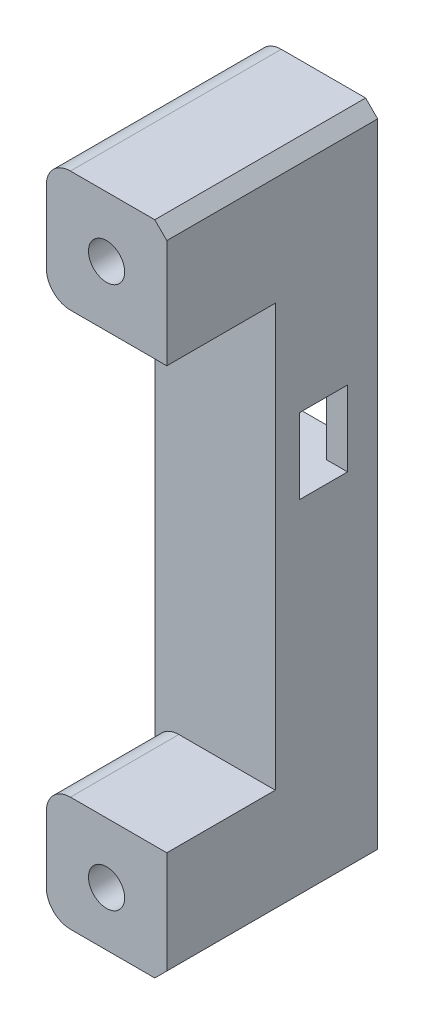
ISO-10303-21;
HEADER;
FILE_DESCRIPTION(('STEP AP214'),'2;1');
FILE_NAME('part.step','',(''),(''),'','','');
FILE_SCHEMA(('AUTOMOTIVE_DESIGN { 1 0 10303 214 1 1 1 1 }'));
ENDSEC;
DATA;
#1=APPLICATION_CONTEXT('core data for automotive mechanical design processes');
#2=APPLICATION_PROTOCOL_DEFINITION('international standard','automotive_design',2000,#1);
#3=PRODUCT_CONTEXT('',#1,'mechanical');
#4=PRODUCT('Part','Part','',(#3));
#5=PRODUCT_RELATED_PRODUCT_CATEGORY('part','',(#4));
#6=PRODUCT_DEFINITION_FORMATION('','',#4);
#7=PRODUCT_DEFINITION_CONTEXT('part definition',#1,'design');
#8=PRODUCT_DEFINITION('design','',#6,#7);
#9=PRODUCT_DEFINITION_SHAPE('','',#8);
#10=(LENGTH_UNIT() NAMED_UNIT(*) SI_UNIT(.MILLI.,.METRE.));
#11=(NAMED_UNIT(*) PLANE_ANGLE_UNIT() SI_UNIT($,.RADIAN.));
#12=(NAMED_UNIT(*) SI_UNIT($,.STERADIAN.) SOLID_ANGLE_UNIT());
#13=UNCERTAINTY_MEASURE_WITH_UNIT(LENGTH_MEASURE(1.E-05),#10,'distance_accuracy_value','');
#14=(GEOMETRIC_REPRESENTATION_CONTEXT(3) GLOBAL_UNCERTAINTY_ASSIGNED_CONTEXT((#13)) GLOBAL_UNIT_ASSIGNED_CONTEXT((#10,
#11,#12)) REPRESENTATION_CONTEXT('',''));
#15=CARTESIAN_POINT('',(0.,0.,0.));
#16=DIRECTION('',(0.,0.,1.));
#17=DIRECTION('',(1.,0.,0.));
#18=AXIS2_PLACEMENT_3D('',#15,#16,#17);
#19=CARTESIAN_POINT('',(0.,-5.489636331587E-12,219.98943109955));
#20=DIRECTION('',(0.,0.,-1.));
#21=DIRECTION('',(0.,1.,0.));
#22=AXIS2_PLACEMENT_3D('',#19,#20,#21);
#23=PLANE('',#22);
#24=DIRECTION('',(0.,-1.,0.));
#25=VECTOR('',#24,1.);
#26=CARTESIAN_POINT('',(-769.850538245303,61.1086835195317,219.989431099551));
#27=LINE('',#26,#25);
#28=CARTESIAN_POINT('',(-769.850538245303,61.1086835195317,219.989431099551));
#29=VERTEX_POINT('',#28);
#30=CARTESIAN_POINT('',(-769.850538245303,48.6086835195317,219.989431099551));
#31=VERTEX_POINT('',#30);
#32=EDGE_CURVE('E258',#29,#31,#27,.T.);
#33=ORIENTED_EDGE('',*,*,#32,.F.);
#34=DIRECTION('',(-1.,0.,0.));
#35=VECTOR('',#34,1.);
#36=CARTESIAN_POINT('',(-777.850538245303,61.1086835195317,219.989431099551));
#37=LINE('',#36,#35);
#38=CARTESIAN_POINT('',(-760.850538245303,61.1086835195317,219.989431099551));
#39=VERTEX_POINT('',#38);
#40=EDGE_CURVE('E485',#39,#29,#37,.T.);
#41=ORIENTED_EDGE('',*,*,#40,.F.);
#42=DIRECTION('',(0.,-1.,0.));
#43=VECTOR('',#42,1.);
#44=CARTESIAN_POINT('',(-760.850538245303,98.8586835195317,219.989431099552));
#45=LINE('',#44,#43);
#46=CARTESIAN_POINT('',(-760.850538245303,48.6086835195317,219.989431099551));
#47=VERTEX_POINT('',#46);
#48=EDGE_CURVE('E314',#39,#47,#45,.T.);
#49=ORIENTED_EDGE('',*,*,#48,.T.);
#50=DIRECTION('',(1.,0.,0.));
#51=VECTOR('',#50,1.);
#52=CARTESIAN_POINT('',(-777.850538245303,48.6086835195317,219.989431099551));
#53=LINE('',#52,#51);
#54=EDGE_CURVE('E241',#31,#47,#53,.T.);
#55=ORIENTED_EDGE('',*,*,#54,.F.);
#56=EDGE_LOOP('',(#33,#41,#49,#55));
#57=FACE_BOUND('',#56,.T.);
#58=ADVANCED_FACE('F33',(#57),#23,.T.);
#59=CARTESIAN_POINT('',(0.,-5.58955640380326E-12,223.98943109955));
#60=DIRECTION('',(0.,0.,-1.));
#61=DIRECTION('',(0.,1.,0.));
#62=AXIS2_PLACEMENT_3D('',#59,#60,#61);
#63=PLANE('',#62);
#64=DIRECTION('',(-1.,0.,0.));
#65=VECTOR('',#64,1.);
#66=CARTESIAN_POINT('',(-760.850538245302,78.8586835195316,223.989431099552));
#67=LINE('',#66,#65);
#68=CARTESIAN_POINT('',(-760.850538245302,78.8586835195316,223.989431099552));
#69=VERTEX_POINT('',#68);
#70=CARTESIAN_POINT('',(-776.850538245303,78.8586835195316,223.989431099552));
#71=VERTEX_POINT('',#70);
#72=EDGE_CURVE('E298',#69,#71,#67,.T.);
#73=ORIENTED_EDGE('',*,*,#72,.T.);
#74=CARTESIAN_POINT('',(-776.850538245303,82.8586835195316,223.989431099552));
#75=DIRECTION('',(0.,0.,-1.));
#76=DIRECTION('',(0.,1.,0.));
#77=AXIS2_PLACEMENT_3D('',#74,#75,#76);
#78=CIRCLE('',#77,4.);
#79=CARTESIAN_POINT('',(-780.850538245302,82.8586835195316,223.989431099552));
#80=VERTEX_POINT('',#79);
#81=EDGE_CURVE('E400',#71,#80,#78,.T.);
#82=ORIENTED_EDGE('',*,*,#81,.T.);
#83=DIRECTION('',(0.,1.,0.));
#84=VECTOR('',#83,1.);
#85=CARTESIAN_POINT('',(-780.850538245303,-10.1413164804685,223.98943109955));
#86=LINE('',#85,#84);
#87=CARTESIAN_POINT('',(-780.850538245303,4.85868351953156,223.98943109955));
#88=VERTEX_POINT('',#87);
#89=EDGE_CURVE('E317',#88,#80,#86,.T.);
#90=ORIENTED_EDGE('',*,*,#89,.F.);
#91=CARTESIAN_POINT('',(-776.850538245303,4.85868351953156,223.98943109955));
#92=DIRECTION('',(0.,0.,-1.));
#93=DIRECTION('',(0.,1.,0.));
#94=AXIS2_PLACEMENT_3D('',#91,#92,#93);
#95=CIRCLE('',#94,4.);
#96=CARTESIAN_POINT('',(-776.850538245303,8.85868351953156,223.98943109955));
#97=VERTEX_POINT('',#96);
#98=EDGE_CURVE('E398',#88,#97,#95,.T.);
#99=ORIENTED_EDGE('',*,*,#98,.T.);
#100=DIRECTION('',(1.,0.,0.));
#101=VECTOR('',#100,1.);
#102=CARTESIAN_POINT('',(-780.850538245303,8.85868351953156,223.98943109955));
#103=LINE('',#102,#101);
#104=CARTESIAN_POINT('',(-760.850538245303,8.85868351953159,223.98943109955));
#105=VERTEX_POINT('',#104);
#106=EDGE_CURVE('E324',#97,#105,#103,.T.);
#107=ORIENTED_EDGE('',*,*,#106,.T.);
#108=DIRECTION('',(0.,-1.,0.));
#109=VECTOR('',#108,1.);
#110=CARTESIAN_POINT('',(-760.850538245303,98.8586835195316,223.989431099552));
#111=LINE('',#110,#109);
#112=EDGE_CURVE('E313',#69,#105,#111,.T.);
#113=ORIENTED_EDGE('',*,*,#112,.F.);
#114=EDGE_LOOP('',(#73,#82,#90,#99,#107,#113));
#115=FACE_BOUND('',#114,.T.);
#116=ADVANCED_FACE('F458',(#115),#63,.F.);
#117=CARTESIAN_POINT('',(0.,-6.00955006327009E-12,241.98943109955));
#118=DIRECTION('',(0.,0.,-1.));
#119=DIRECTION('',(0.,1.,0.));
#120=AXIS2_PLACEMENT_3D('',#117,#118,#119);
#121=PLANE('',#120);
#122=DIRECTION('',(-1.,0.,0.));
#123=VECTOR('',#122,1.);
#124=CARTESIAN_POINT('',(-760.850538245303,-10.1413164804689,241.98943109955));
#125=LINE('',#124,#123);
#126=CARTESIAN_POINT('',(-762.850538245303,-10.1413164804689,241.98943109955));
#127=VERTEX_POINT('',#126);
#128=CARTESIAN_POINT('',(-776.850538245303,-10.1413164804689,241.98943109955));
#129=VERTEX_POINT('',#128);
#130=EDGE_CURVE('E332',#127,#129,#125,.T.);
#131=ORIENTED_EDGE('',*,*,#130,.F.);
#132=DIRECTION('',(-0.70710678118655,-0.707106781186545,0.));
#133=VECTOR('',#132,1.);
#134=CARTESIAN_POINT('',(-762.850538245303,-10.1413164804689,241.98943109955));
#135=LINE('',#134,#133);
#136=CARTESIAN_POINT('',(-760.850538245303,-8.14131648046891,241.98943109955));
#137=VERTEX_POINT('',#136);
#138=EDGE_CURVE('E406',#127,#137,#135,.F.);
#139=ORIENTED_EDGE('',*,*,#138,.T.);
#140=DIRECTION('',(0.,-1.,0.));
#141=VECTOR('',#140,1.);
#142=CARTESIAN_POINT('',(-760.850538245303,8.85868351953112,241.98943109955));
#143=LINE('',#142,#141);
#144=CARTESIAN_POINT('',(-760.850538245303,8.85868351953112,241.98943109955));
#145=VERTEX_POINT('',#144);
#146=EDGE_CURVE('E329',#145,#137,#143,.T.);
#147=ORIENTED_EDGE('',*,*,#146,.F.);
#148=DIRECTION('',(1.,0.,0.));
#149=VECTOR('',#148,1.);
#150=CARTESIAN_POINT('',(-780.850538245303,8.85868351953112,241.98943109955));
#151=LINE('',#150,#149);
#152=CARTESIAN_POINT('',(-776.850538245303,8.85868351953112,241.98943109955));
#153=VERTEX_POINT('',#152);
#154=EDGE_CURVE('E323',#153,#145,#151,.T.);
#155=ORIENTED_EDGE('',*,*,#154,.F.);
#156=CARTESIAN_POINT('',(-776.850538245303,4.85868351953112,241.98943109955));
#157=DIRECTION('',(0.,0.,-1.));
#158=DIRECTION('',(0.,1.,0.));
#159=AXIS2_PLACEMENT_3D('',#156,#157,#158);
#160=CIRCLE('',#159,4.);
#161=CARTESIAN_POINT('',(-780.850538245303,4.85868351953112,241.98943109955));
#162=VERTEX_POINT('',#161);
#163=EDGE_CURVE('E374',#153,#162,#160,.F.);
#164=ORIENTED_EDGE('',*,*,#163,.T.);
#165=DIRECTION('',(0.,1.,0.));
#166=VECTOR('',#165,1.);
#167=CARTESIAN_POINT('',(-780.850538245303,-10.1413164804689,241.98943109955));
#168=LINE('',#167,#166);
#169=CARTESIAN_POINT('',(-780.850538245303,-6.14131648046889,241.98943109955));
#170=VERTEX_POINT('',#169);
#171=EDGE_CURVE('E327',#170,#162,#168,.T.);
#172=ORIENTED_EDGE('',*,*,#171,.F.);
#173=CARTESIAN_POINT('',(-776.850538245303,-6.14131648046889,241.98943109955));
#174=DIRECTION('',(0.,0.,-1.));
#175=DIRECTION('',(0.,1.,0.));
#176=AXIS2_PLACEMENT_3D('',#173,#174,#175);
#177=CIRCLE('',#176,4.);
#178=EDGE_CURVE('E376',#170,#129,#177,.F.);
#179=ORIENTED_EDGE('',*,*,#178,.T.);
#180=EDGE_LOOP('',(#131,#139,#147,#155,#164,#172,#179));
#181=FACE_BOUND('',#180,.T.);
#182=CARTESIAN_POINT('',(-770.850538245303,-1.14131648046875,241.98943109955));
#183=DIRECTION('',(0.,0.,-1.));
#184=DIRECTION('',(0.,1.,0.));
#185=AXIS2_PLACEMENT_3D('',#182,#183,#184);
#186=CIRCLE('',#185,3.00000000000005);
#187=CARTESIAN_POINT('',(-770.850538245303,1.8586835195313,241.98943109955));
#188=VERTEX_POINT('',#187);
#189=EDGE_CURVE('E316',#188,#188,#186,.T.);
#190=ORIENTED_EDGE('',*,*,#189,.T.);
#191=EDGE_LOOP('',(#190));
#192=FACE_BOUND('',#191,.T.);
#193=ADVANCED_FACE('F438',(#181,#192),#121,.F.);
#194=CARTESIAN_POINT('',(-780.850538245303,8.85868351953156,223.98943109955));
#195=DIRECTION('',(0.,-1.,0.));
#196=DIRECTION('',(0.,0.,-1.));
#197=AXIS2_PLACEMENT_3D('',#194,#195,#196);
#198=PLANE('',#197);
#199=ORIENTED_EDGE('',*,*,#106,.F.);
#200=DIRECTION('',(0.,0.,1.));
#201=VECTOR('',#200,1.);
#202=CARTESIAN_POINT('',(-776.850538245303,8.85868351953156,223.98943109955));
#203=LINE('',#202,#201);
#204=EDGE_CURVE('E386',#97,#153,#203,.T.);
#205=ORIENTED_EDGE('',*,*,#204,.T.);
#206=ORIENTED_EDGE('',*,*,#154,.T.);
#207=DIRECTION('',(0.,0.,1.));
#208=VECTOR('',#207,1.);
#209=CARTESIAN_POINT('',(-760.850538245303,8.85868351953156,223.98943109955));
#210=LINE('',#209,#208);
#211=EDGE_CURVE('E326',#105,#145,#210,.T.);
#212=ORIENTED_EDGE('',*,*,#211,.F.);
#213=EDGE_LOOP('',(#199,#205,#206,#212));
#214=FACE_BOUND('',#213,.T.);
#215=ADVANCED_FACE('F446',(#214),#198,.F.);
#216=CARTESIAN_POINT('',(-760.850538245303,8.85868351953156,223.98943109955));
#217=DIRECTION('',(-1.,0.,0.));
#218=DIRECTION('',(0.,0.,1.));
#219=AXIS2_PLACEMENT_3D('',#216,#217,#218);
#220=PLANE('',#219);
#221=DIRECTION('',(0.,-1.,0.));
#222=VECTOR('',#221,1.);
#223=CARTESIAN_POINT('',(-760.850538245303,48.6086835195319,211.989431099551));
#224=LINE('',#223,#222);
#225=CARTESIAN_POINT('',(-760.850538245303,61.1086835195319,211.989431099551));
#226=VERTEX_POINT('',#225);
#227=CARTESIAN_POINT('',(-760.850538245303,48.6086835195319,211.989431099551));
#228=VERTEX_POINT('',#227);
#229=EDGE_CURVE('E221',#226,#228,#224,.T.);
#230=ORIENTED_EDGE('',*,*,#229,.T.);
#231=DIRECTION('',(0.,0.,1.));
#232=VECTOR('',#231,1.);
#233=CARTESIAN_POINT('',(-760.850538245303,48.608683519532,206.989431099551));
#234=LINE('',#233,#232);
#235=EDGE_CURVE('E233',#228,#47,#234,.T.);
#236=ORIENTED_EDGE('',*,*,#235,.T.);
#237=ORIENTED_EDGE('',*,*,#48,.F.);
#238=DIRECTION('',(0.,0.,1.));
#239=VECTOR('',#238,1.);
#240=CARTESIAN_POINT('',(-760.850538245303,61.108683519532,206.989431099551));
#241=LINE('',#240,#239);
#242=EDGE_CURVE('E235',#226,#39,#241,.T.);
#243=ORIENTED_EDGE('',*,*,#242,.F.);
#244=EDGE_LOOP('',(#230,#236,#237,#243));
#245=FACE_BOUND('',#244,.T.);
#246=ORIENTED_EDGE('',*,*,#146,.T.);
#247=DIRECTION('',(0.,0.,-1.));
#248=VECTOR('',#247,1.);
#249=CARTESIAN_POINT('',(-760.850538245303,-8.14131648046846,223.98943109955));
#250=LINE('',#249,#248);
#251=CARTESIAN_POINT('',(-760.850538245303,-8.14131648046805,206.98943109955));
#252=VERTEX_POINT('',#251);
#253=EDGE_CURVE('E411',#137,#252,#250,.T.);
#254=ORIENTED_EDGE('',*,*,#253,.T.);
#255=DIRECTION('',(0.,-1.,0.));
#256=VECTOR('',#255,1.);
#257=CARTESIAN_POINT('',(-760.850538245303,48.608683519532,206.989431099551));
#258=LINE('',#257,#256);
#259=CARTESIAN_POINT('',(-760.850538245302,96.858683519532,206.989431099552));
#260=VERTEX_POINT('',#259);
#261=EDGE_CURVE('E424',#260,#252,#258,.T.);
#262=ORIENTED_EDGE('',*,*,#261,.F.);
#263=DIRECTION('',(0.,0.,1.));
#264=VECTOR('',#263,1.);
#265=CARTESIAN_POINT('',(-760.850538245303,96.8586835195315,223.989431099552));
#266=LINE('',#265,#264);
#267=CARTESIAN_POINT('',(-760.850538245303,96.8586835195311,241.989431099552));
#268=VERTEX_POINT('',#267);
#269=EDGE_CURVE('E408',#260,#268,#266,.T.);
#270=ORIENTED_EDGE('',*,*,#269,.T.);
#271=DIRECTION('',(0.,-1.,0.));
#272=VECTOR('',#271,1.);
#273=CARTESIAN_POINT('',(-760.850538245303,98.8586835195311,241.989431099552));
#274=LINE('',#273,#272);
#275=CARTESIAN_POINT('',(-760.850538245302,78.8586835195311,241.989431099552));
#276=VERTEX_POINT('',#275);
#277=EDGE_CURVE('E297',#268,#276,#274,.T.);
#278=ORIENTED_EDGE('',*,*,#277,.T.);
#279=DIRECTION('',(0.,0.,1.));
#280=VECTOR('',#279,1.);
#281=CARTESIAN_POINT('',(-760.850538245302,78.8586835195316,223.989431099552));
#282=LINE('',#281,#280);
#283=EDGE_CURVE('E301',#69,#276,#282,.T.);
#284=ORIENTED_EDGE('',*,*,#283,.F.);
#285=ORIENTED_EDGE('',*,*,#112,.T.);
#286=ORIENTED_EDGE('',*,*,#211,.T.);
#287=EDGE_LOOP('',(#246,#254,#262,#270,#278,#284,#285,#286));
#288=FACE_BOUND('',#287,.T.);
#289=ADVANCED_FACE('F230',(#245,#288),#220,.F.);
#290=CARTESIAN_POINT('',(-760.850538245303,-10.1413164804685,223.98943109955));
#291=DIRECTION('',(0.,1.,0.));
#292=DIRECTION('',(0.,0.,1.));
#293=AXIS2_PLACEMENT_3D('',#290,#291,#292);
#294=PLANE('',#293);
#295=DIRECTION('',(-1.,0.,0.));
#296=VECTOR('',#295,1.);
#297=CARTESIAN_POINT('',(-760.850538245303,-10.141316480468,206.98943109955));
#298=LINE('',#297,#296);
#299=CARTESIAN_POINT('',(-762.850538245303,-10.141316480468,206.98943109955));
#300=VERTEX_POINT('',#299);
#301=CARTESIAN_POINT('',(-776.850538245303,-10.141316480468,206.98943109955));
#302=VERTEX_POINT('',#301);
#303=EDGE_CURVE('E422',#300,#302,#298,.T.);
#304=ORIENTED_EDGE('',*,*,#303,.F.);
#305=DIRECTION('',(0.,0.,1.));
#306=VECTOR('',#305,1.);
#307=CARTESIAN_POINT('',(-762.850538245303,-10.1413164804685,223.98943109955));
#308=LINE('',#307,#306);
#309=EDGE_CURVE('E403',#300,#127,#308,.T.);
#310=ORIENTED_EDGE('',*,*,#309,.T.);
#311=ORIENTED_EDGE('',*,*,#130,.T.);
#312=DIRECTION('',(0.,0.,1.));
#313=VECTOR('',#312,1.);
#314=CARTESIAN_POINT('',(-776.850538245303,-10.1413164804685,223.98943109955));
#315=LINE('',#314,#313);
#316=EDGE_CURVE('E379',#129,#302,#315,.F.);
#317=ORIENTED_EDGE('',*,*,#316,.T.);
#318=EDGE_LOOP('',(#304,#310,#311,#317));
#319=FACE_BOUND('',#318,.T.);
#320=ADVANCED_FACE('F429',(#319),#294,.F.);
#321=CARTESIAN_POINT('',(-780.850538245303,-10.1413164804685,223.98943109955));
#322=DIRECTION('',(1.,0.,0.));
#323=DIRECTION('',(0.,0.,-1.));
#324=AXIS2_PLACEMENT_3D('',#321,#322,#323);
#325=PLANE('',#324);
#326=DIRECTION('',(0.,1.,0.));
#327=VECTOR('',#326,1.);
#328=CARTESIAN_POINT('',(-780.850538245303,-10.141316480468,206.98943109955));
#329=LINE('',#328,#327);
#330=CARTESIAN_POINT('',(-780.850538245303,-6.14131648046804,206.98943109955));
#331=VERTEX_POINT('',#330);
#332=CARTESIAN_POINT('',(-780.850538245303,49.8586835195313,206.989431099551));
#333=VERTEX_POINT('',#332);
#334=EDGE_CURVE('E433',#331,#333,#329,.T.);
#335=ORIENTED_EDGE('',*,*,#334,.F.);
#336=DIRECTION('',(0.,0.,1.));
#337=VECTOR('',#336,1.);
#338=CARTESIAN_POINT('',(-780.850538245303,-6.14131648046845,223.98943109955));
#339=LINE('',#338,#337);
#340=EDGE_CURVE('E371',#331,#170,#339,.T.);
#341=ORIENTED_EDGE('',*,*,#340,.T.);
#342=ORIENTED_EDGE('',*,*,#171,.T.);
#343=DIRECTION('',(0.,0.,1.));
#344=VECTOR('',#343,1.);
#345=CARTESIAN_POINT('',(-780.850538245303,4.85868351953156,223.98943109955));
#346=LINE('',#345,#344);
#347=EDGE_CURVE('E368',#162,#88,#346,.F.);
#348=ORIENTED_EDGE('',*,*,#347,.T.);
#349=ORIENTED_EDGE('',*,*,#89,.T.);
#350=DIRECTION('',(0.,0.,1.));
#351=VECTOR('',#350,1.);
#352=CARTESIAN_POINT('',(-780.850538245303,82.8586835195316,223.989431099552));
#353=LINE('',#352,#351);
#354=CARTESIAN_POINT('',(-780.850538245302,82.8586835195311,241.989431099552));
#355=VERTEX_POINT('',#354);
#356=EDGE_CURVE('E365',#80,#355,#353,.T.);
#357=ORIENTED_EDGE('',*,*,#356,.T.);
#358=DIRECTION('',(0.,1.,0.));
#359=VECTOR('',#358,1.);
#360=CARTESIAN_POINT('',(-780.850538245302,78.8586835195311,241.989431099552));
#361=LINE('',#360,#359);
#362=CARTESIAN_POINT('',(-780.850538245302,94.8586835195313,241.989431099552));
#363=VERTEX_POINT('',#362);
#364=EDGE_CURVE('E307',#355,#363,#361,.T.);
#365=ORIENTED_EDGE('',*,*,#364,.T.);
#366=DIRECTION('',(0.,0.,1.));
#367=VECTOR('',#366,1.);
#368=CARTESIAN_POINT('',(-780.850538245303,94.8586835195318,223.989431099552));
#369=LINE('',#368,#367);
#370=CARTESIAN_POINT('',(-780.850538245302,94.8586835195322,206.989431099552));
#371=VERTEX_POINT('',#370);
#372=EDGE_CURVE('E356',#363,#371,#369,.F.);
#373=ORIENTED_EDGE('',*,*,#372,.T.);
#374=DIRECTION('',(0.,1.,0.));
#375=VECTOR('',#374,1.);
#376=CARTESIAN_POINT('',(-780.850538245303,59.858683519532,206.989431099551));
#377=LINE('',#376,#375);
#378=CARTESIAN_POINT('',(-780.850538245303,61.8586835195327,206.989431099551));
#379=VERTEX_POINT('',#378);
#380=EDGE_CURVE('E475',#379,#371,#377,.T.);
#381=ORIENTED_EDGE('',*,*,#380,.F.);
#382=DIRECTION('',(0.,0.,1.));
#383=VECTOR('',#382,1.);
#384=CARTESIAN_POINT('',(-780.850538245303,61.8586835195323,223.989431099551));
#385=LINE('',#384,#383);
#386=CARTESIAN_POINT('',(-780.850538245303,61.8586835195325,215.989431099552));
#387=VERTEX_POINT('',#386);
#388=EDGE_CURVE('E341',#379,#387,#385,.T.);
#389=ORIENTED_EDGE('',*,*,#388,.T.);
#390=DIRECTION('',(0.,-1.,0.));
#391=VECTOR('',#390,1.);
#392=CARTESIAN_POINT('',(-780.850538245303,51.8586835195318,215.989431099552));
#393=LINE('',#392,#391);
#394=CARTESIAN_POINT('',(-780.850538245303,49.858683519531,215.989431099552));
#395=VERTEX_POINT('',#394);
#396=EDGE_CURVE('E343',#387,#395,#393,.T.);
#397=ORIENTED_EDGE('',*,*,#396,.T.);
#398=DIRECTION('',(0.,0.,-1.));
#399=VECTOR('',#398,1.);
#400=CARTESIAN_POINT('',(-780.850538245303,49.8586835195308,223.989431099551));
#401=LINE('',#400,#399);
#402=EDGE_CURVE('E345',#395,#333,#401,.T.);
#403=ORIENTED_EDGE('',*,*,#402,.T.);
#404=EDGE_LOOP('',(#335,#341,#342,#348,#349,#357,#365,#373,#381,#389,#397,#403));
#405=FACE_BOUND('',#404,.T.);
#406=ADVANCED_FACE('F453',(#405),#325,.F.);
#407=CARTESIAN_POINT('',(-770.850538245303,-1.14131648046831,223.98943109955));
#408=DIRECTION('',(0.,0.,1.));
#409=DIRECTION('',(0.,-1.,0.));
#410=AXIS2_PLACEMENT_3D('',#407,#408,#409);
#411=CYLINDRICAL_SURFACE('',#410,3.00000000000005);
#412=ORIENTED_EDGE('',*,*,#189,.F.);
#413=EDGE_LOOP('',(#412));
#414=FACE_BOUND('',#413,.T.);
#415=CARTESIAN_POINT('',(-770.850538245303,-1.14131648046788,206.98943109955));
#416=DIRECTION('',(0.,0.,-1.));
#417=DIRECTION('',(0.,1.,0.));
#418=AXIS2_PLACEMENT_3D('',#415,#416,#417);
#419=CIRCLE('',#418,3.00000000000005);
#420=CARTESIAN_POINT('',(-770.850538245303,1.85868351953217,206.98943109955));
#421=VERTEX_POINT('',#420);
#422=EDGE_CURVE('E491',#421,#421,#419,.T.);
#423=ORIENTED_EDGE('',*,*,#422,.T.);
#424=EDGE_LOOP('',(#423));
#425=FACE_BOUND('',#424,.T.);
#426=ADVANCED_FACE('F585',(#414,#425),#411,.F.);
#427=CARTESIAN_POINT('',(-780.850538245302,98.858683519532,219.989431099552));
#428=DIRECTION('',(0.,-1.,0.));
#429=DIRECTION('',(0.,0.,-1.));
#430=AXIS2_PLACEMENT_3D('',#427,#428,#429);
#431=PLANE('',#430);
#432=DIRECTION('',(1.,0.,0.));
#433=VECTOR('',#432,1.);
#434=CARTESIAN_POINT('',(-780.850538245302,98.8586835195314,241.989431099552));
#435=LINE('',#434,#433);
#436=CARTESIAN_POINT('',(-776.850538245303,98.8586835195314,241.989431099552));
#437=VERTEX_POINT('',#436);
#438=CARTESIAN_POINT('',(-762.850538245303,98.8586835195311,241.989431099552));
#439=VERTEX_POINT('',#438);
#440=EDGE_CURVE('E302',#437,#439,#435,.T.);
#441=ORIENTED_EDGE('',*,*,#440,.T.);
#442=DIRECTION('',(0.,0.,-1.));
#443=VECTOR('',#442,1.);
#444=CARTESIAN_POINT('',(-762.850538245303,98.8586835195317,219.989431099552));
#445=LINE('',#444,#443);
#446=CARTESIAN_POINT('',(-762.850538245303,98.858683519532,206.989431099552));
#447=VERTEX_POINT('',#446);
#448=EDGE_CURVE('E11',#439,#447,#445,.T.);
#449=ORIENTED_EDGE('',*,*,#448,.T.);
#450=DIRECTION('',(1.,0.,0.));
#451=VECTOR('',#450,1.);
#452=CARTESIAN_POINT('',(-780.850538245302,98.8586835195323,206.989431099552));
#453=LINE('',#452,#451);
#454=CARTESIAN_POINT('',(-776.850538245303,98.8586835195322,206.989431099552));
#455=VERTEX_POINT('',#454);
#456=EDGE_CURVE('E472',#455,#447,#453,.T.);
#457=ORIENTED_EDGE('',*,*,#456,.F.);
#458=DIRECTION('',(0.,0.,1.));
#459=VECTOR('',#458,1.);
#460=CARTESIAN_POINT('',(-776.850538245303,98.8586835195319,219.989431099552));
#461=LINE('',#460,#459);
#462=EDGE_CURVE('E395',#455,#437,#461,.T.);
#463=ORIENTED_EDGE('',*,*,#462,.T.);
#464=EDGE_LOOP('',(#441,#449,#457,#463));
#465=FACE_BOUND('',#464,.T.);
#466=ADVANCED_FACE('F471',(#465),#431,.F.);
#467=CARTESIAN_POINT('',(-770.850538245302,88.8586835195318,219.989431099552));
#468=DIRECTION('',(0.,0.,1.));
#469=DIRECTION('',(0.,-1.,0.));
#470=AXIS2_PLACEMENT_3D('',#467,#468,#469);
#471=CYLINDRICAL_SURFACE('',#470,3.00000000000005);
#472=CARTESIAN_POINT('',(-770.850538245302,88.8586835195313,241.989431099552));
#473=DIRECTION('',(0.,0.,-1.));
#474=DIRECTION('',(0.,1.,0.));
#475=AXIS2_PLACEMENT_3D('',#472,#473,#474);
#476=CIRCLE('',#475,3.00000000000005);
#477=CARTESIAN_POINT('',(-770.850538245302,91.8586835195313,241.989431099552));
#478=VERTEX_POINT('',#477);
#479=EDGE_CURVE('E294',#478,#478,#476,.T.);
#480=ORIENTED_EDGE('',*,*,#479,.F.);
#481=EDGE_LOOP('',(#480));
#482=FACE_BOUND('',#481,.T.);
#483=CARTESIAN_POINT('',(-770.850538245302,88.8586835195321,206.989431099552));
#484=DIRECTION('',(0.,0.,-1.));
#485=DIRECTION('',(0.,1.,0.));
#486=AXIS2_PLACEMENT_3D('',#483,#484,#485);
#487=CIRCLE('',#486,3.00000000000005);
#488=CARTESIAN_POINT('',(-770.850538245302,91.8586835195322,206.989431099552));
#489=VERTEX_POINT('',#488);
#490=EDGE_CURVE('E363',#489,#489,#487,.T.);
#491=ORIENTED_EDGE('',*,*,#490,.T.);
#492=EDGE_LOOP('',(#491));
#493=FACE_BOUND('',#492,.T.);
#494=ADVANCED_FACE('F580',(#482,#493),#471,.F.);
#495=CARTESIAN_POINT('',(0.,-6.04490035775992E-12,241.98943109955));
#496=DIRECTION('',(0.,0.,-1.));
#497=DIRECTION('',(0.,1.,0.));
#498=AXIS2_PLACEMENT_3D('',#495,#496,#497);
#499=PLANE('',#498);
#500=ORIENTED_EDGE('',*,*,#277,.F.);
#501=DIRECTION('',(0.707106781186541,-0.707106781186554,0.));
#502=VECTOR('',#501,1.);
#503=CARTESIAN_POINT('',(-760.850538245303,96.8586835195311,241.989431099552));
#504=LINE('',#503,#502);
#505=EDGE_CURVE('E41',#268,#439,#504,.F.);
#506=ORIENTED_EDGE('',*,*,#505,.T.);
#507=ORIENTED_EDGE('',*,*,#440,.F.);
#508=CARTESIAN_POINT('',(-776.850538245303,94.8586835195313,241.989431099552));
#509=DIRECTION('',(0.,0.,-1.));
#510=DIRECTION('',(0.,1.,0.));
#511=AXIS2_PLACEMENT_3D('',#508,#509,#510);
#512=CIRCLE('',#511,4.);
#513=EDGE_CURVE('E389',#437,#363,#512,.F.);
#514=ORIENTED_EDGE('',*,*,#513,.T.);
#515=ORIENTED_EDGE('',*,*,#364,.F.);
#516=CARTESIAN_POINT('',(-776.850538245303,82.8586835195311,241.989431099552));
#517=DIRECTION('',(0.,0.,-1.));
#518=DIRECTION('',(0.,1.,0.));
#519=AXIS2_PLACEMENT_3D('',#516,#517,#518);
#520=CIRCLE('',#519,4.);
#521=CARTESIAN_POINT('',(-776.850538245303,78.8586835195311,241.989431099552));
#522=VERTEX_POINT('',#521);
#523=EDGE_CURVE('E391',#355,#522,#520,.F.);
#524=ORIENTED_EDGE('',*,*,#523,.T.);
#525=DIRECTION('',(-1.,0.,0.));
#526=VECTOR('',#525,1.);
#527=CARTESIAN_POINT('',(-760.850538245302,78.8586835195311,241.989431099552));
#528=LINE('',#527,#526);
#529=EDGE_CURVE('E304',#276,#522,#528,.T.);
#530=ORIENTED_EDGE('',*,*,#529,.F.);
#531=EDGE_LOOP('',(#500,#506,#507,#514,#515,#524,#530));
#532=FACE_BOUND('',#531,.T.);
#533=ORIENTED_EDGE('',*,*,#479,.T.);
#534=EDGE_LOOP('',(#533));
#535=FACE_BOUND('',#534,.T.);
#536=ADVANCED_FACE('F464',(#532,#535),#499,.F.);
#537=CARTESIAN_POINT('',(-760.850538245302,78.8586835195316,223.989431099552));
#538=DIRECTION('',(0.,1.,0.));
#539=DIRECTION('',(0.,0.,1.));
#540=AXIS2_PLACEMENT_3D('',#537,#538,#539);
#541=PLANE('',#540);
#542=ORIENTED_EDGE('',*,*,#529,.T.);
#543=DIRECTION('',(0.,0.,1.));
#544=VECTOR('',#543,1.);
#545=CARTESIAN_POINT('',(-776.850538245303,78.8586835195316,223.989431099552));
#546=LINE('',#545,#544);
#547=EDGE_CURVE('E393',#522,#71,#546,.F.);
#548=ORIENTED_EDGE('',*,*,#547,.T.);
#549=ORIENTED_EDGE('',*,*,#72,.F.);
#550=ORIENTED_EDGE('',*,*,#283,.T.);
#551=EDGE_LOOP('',(#542,#548,#549,#550));
#552=FACE_BOUND('',#551,.T.);
#553=ADVANCED_FACE('F623',(#552),#541,.F.);
#554=CARTESIAN_POINT('',(-769.850538245303,61.1086835195318,213.989431099551));
#555=DIRECTION('',(-1.,0.,0.));
#556=DIRECTION('',(0.,0.,1.));
#557=AXIS2_PLACEMENT_3D('',#554,#555,#556);
#558=PLANE('',#557);
#559=ORIENTED_EDGE('',*,*,#32,.T.);
#560=DIRECTION('',(0.,0.,1.));
#561=VECTOR('',#560,1.);
#562=CARTESIAN_POINT('',(-769.850538245303,48.6086835195318,213.989431099551));
#563=LINE('',#562,#561);
#564=CARTESIAN_POINT('',(-769.850538245303,48.6086835195318,213.989431099551));
#565=VERTEX_POINT('',#564);
#566=EDGE_CURVE('E287',#565,#31,#563,.T.);
#567=ORIENTED_EDGE('',*,*,#566,.F.);
#568=DIRECTION('',(0.,-1.,0.));
#569=VECTOR('',#568,1.);
#570=CARTESIAN_POINT('',(-769.850538245303,61.1086835195318,213.989431099551));
#571=LINE('',#570,#569);
#572=CARTESIAN_POINT('',(-769.850538245303,61.1086835195318,213.989431099551));
#573=VERTEX_POINT('',#572);
#574=EDGE_CURVE('E284',#573,#565,#571,.T.);
#575=ORIENTED_EDGE('',*,*,#574,.F.);
#576=DIRECTION('',(0.,0.,1.));
#577=VECTOR('',#576,1.);
#578=CARTESIAN_POINT('',(-769.850538245303,61.1086835195318,213.989431099551));
#579=LINE('',#578,#577);
#580=EDGE_CURVE('E291',#573,#29,#579,.T.);
#581=ORIENTED_EDGE('',*,*,#580,.T.);
#582=EDGE_LOOP('',(#559,#567,#575,#581));
#583=FACE_BOUND('',#582,.T.);
#584=ADVANCED_FACE('F552',(#583),#558,.F.);
#585=CARTESIAN_POINT('',(0.,-5.48651878806625E-12,213.98943109955));
#586=DIRECTION('',(0.,0.,-1.));
#587=DIRECTION('',(0.,1.,0.));
#588=AXIS2_PLACEMENT_3D('',#585,#586,#587);
#589=PLANE('',#588);
#590=CARTESIAN_POINT('',(-775.850538245303,50.8586835195318,213.98943109955));
#591=DIRECTION('',(0.,0.,-1.));
#592=DIRECTION('',(0.,1.,0.));
#593=AXIS2_PLACEMENT_3D('',#590,#591,#592);
#594=CIRCLE('',#593,0.900000000000005);
#595=CARTESIAN_POINT('',(-775.850538245303,51.7586835195318,213.98943109955));
#596=VERTEX_POINT('',#595);
#597=EDGE_CURVE('E255',#596,#596,#594,.T.);
#598=ORIENTED_EDGE('',*,*,#597,.F.);
#599=EDGE_LOOP('',(#598));
#600=FACE_BOUND('',#599,.T.);
#601=CARTESIAN_POINT('',(-775.850538245303,58.8586835195318,213.98943109955));
#602=DIRECTION('',(0.,0.,-1.));
#603=DIRECTION('',(0.,1.,0.));
#604=AXIS2_PLACEMENT_3D('',#601,#602,#603);
#605=CIRCLE('',#604,0.900000000000005);
#606=CARTESIAN_POINT('',(-775.850538245303,59.7586835195318,213.98943109955));
#607=VERTEX_POINT('',#606);
#608=EDGE_CURVE('E262',#607,#607,#605,.T.);
#609=ORIENTED_EDGE('',*,*,#608,.F.);
#610=EDGE_LOOP('',(#609));
#611=FACE_BOUND('',#610,.T.);
#612=DIRECTION('',(-1.,0.,0.));
#613=VECTOR('',#612,1.);
#614=CARTESIAN_POINT('',(-777.850538245303,51.8586835195318,213.989431099551));
#615=LINE('',#614,#613);
#616=CARTESIAN_POINT('',(-777.850538245303,51.8586835195318,213.989431099551));
#617=VERTEX_POINT('',#616);
#618=CARTESIAN_POINT('',(-778.850538245303,51.8586835195318,213.989431099551));
#619=VERTEX_POINT('',#618);
#620=EDGE_CURVE('E273',#617,#619,#615,.T.);
#621=ORIENTED_EDGE('',*,*,#620,.T.);
#622=DIRECTION('',(0.,1.,0.));
#623=VECTOR('',#622,1.);
#624=CARTESIAN_POINT('',(-778.850538245303,59.8586835195318,213.989431099551));
#625=LINE('',#624,#623);
#626=CARTESIAN_POINT('',(-778.850538245303,59.8586835195318,213.989431099551));
#627=VERTEX_POINT('',#626);
#628=EDGE_CURVE('E350',#619,#627,#625,.T.);
#629=ORIENTED_EDGE('',*,*,#628,.T.);
#630=DIRECTION('',(1.,0.,0.));
#631=VECTOR('',#630,1.);
#632=CARTESIAN_POINT('',(-777.850538245303,59.8586835195318,213.989431099551));
#633=LINE('',#632,#631);
#634=CARTESIAN_POINT('',(-777.850538245303,59.8586835195318,213.989431099551));
#635=VERTEX_POINT('',#634);
#636=EDGE_CURVE('E276',#627,#635,#633,.T.);
#637=ORIENTED_EDGE('',*,*,#636,.T.);
#638=DIRECTION('',(0.,1.,0.));
#639=VECTOR('',#638,1.);
#640=CARTESIAN_POINT('',(-777.850538245303,61.1086835195318,213.989431099551));
#641=LINE('',#640,#639);
#642=CARTESIAN_POINT('',(-777.850538245303,61.1086835195318,213.989431099551));
#643=VERTEX_POINT('',#642);
#644=EDGE_CURVE('E278',#635,#643,#641,.T.);
#645=ORIENTED_EDGE('',*,*,#644,.T.);
#646=DIRECTION('',(1.,0.,0.));
#647=VECTOR('',#646,1.);
#648=CARTESIAN_POINT('',(-777.850538245303,61.1086835195318,213.989431099551));
#649=LINE('',#648,#647);
#650=EDGE_CURVE('E281',#643,#573,#649,.T.);
#651=ORIENTED_EDGE('',*,*,#650,.T.);
#652=ORIENTED_EDGE('',*,*,#574,.T.);
#653=DIRECTION('',(-1.,0.,0.));
#654=VECTOR('',#653,1.);
#655=CARTESIAN_POINT('',(-769.850538245303,48.6086835195318,213.989431099551));
#656=LINE('',#655,#654);
#657=CARTESIAN_POINT('',(-777.850538245303,48.6086835195318,213.989431099551));
#658=VERTEX_POINT('',#657);
#659=EDGE_CURVE('E267',#565,#658,#656,.T.);
#660=ORIENTED_EDGE('',*,*,#659,.T.);
#661=DIRECTION('',(0.,1.,0.));
#662=VECTOR('',#661,1.);
#663=CARTESIAN_POINT('',(-777.850538245303,48.6086835195318,213.989431099551));
#664=LINE('',#663,#662);
#665=EDGE_CURVE('E270',#658,#617,#664,.T.);
#666=ORIENTED_EDGE('',*,*,#665,.T.);
#667=EDGE_LOOP('',(#621,#629,#637,#645,#651,#652,#660,#666));
#668=FACE_BOUND('',#667,.T.);
#669=ADVANCED_FACE('F545',(#600,#611,#668),#589,.T.);
#670=CARTESIAN_POINT('',(-775.850538245303,58.8586835195318,213.98943109955));
#671=DIRECTION('',(0.,0.,1.));
#672=DIRECTION('',(0.,-1.,0.));
#673=AXIS2_PLACEMENT_3D('',#670,#671,#672);
#674=CYLINDRICAL_SURFACE('',#673,0.900000000000005);
#675=ORIENTED_EDGE('',*,*,#608,.T.);
#676=EDGE_LOOP('',(#675));
#677=FACE_BOUND('',#676,.T.);
#678=CARTESIAN_POINT('',(-775.850538245303,58.8586835195317,219.989431099551));
#679=DIRECTION('',(0.,0.,-1.));
#680=DIRECTION('',(0.,1.,0.));
#681=AXIS2_PLACEMENT_3D('',#678,#679,#680);
#682=CIRCLE('',#681,0.900000000000005);
#683=CARTESIAN_POINT('',(-775.850538245303,59.7586835195317,219.989431099551));
#684=VERTEX_POINT('',#683);
#685=EDGE_CURVE('E254',#684,#684,#682,.T.);
#686=ORIENTED_EDGE('',*,*,#685,.F.);
#687=EDGE_LOOP('',(#686));
#688=FACE_BOUND('',#687,.T.);
#689=ADVANCED_FACE('F634',(#677,#688),#674,.F.);
#690=CARTESIAN_POINT('',(-775.850538245303,58.8586835195317,219.989431099551));
#691=DIRECTION('',(0.,0.,-1.));
#692=DIRECTION('',(0.,1.,0.));
#693=AXIS2_PLACEMENT_3D('',#690,#691,#692);
#694=PLANE('',#693);
#695=ORIENTED_EDGE('',*,*,#685,.T.);
#696=EDGE_LOOP('',(#695));
#697=FACE_BOUND('',#696,.T.);
#698=ADVANCED_FACE('F638',(#697),#694,.T.);
#699=CARTESIAN_POINT('',(-775.850538245303,50.8586835195318,213.98943109955));
#700=DIRECTION('',(0.,0.,1.));
#701=DIRECTION('',(0.,-1.,0.));
#702=AXIS2_PLACEMENT_3D('',#699,#700,#701);
#703=CYLINDRICAL_SURFACE('',#702,0.900000000000005);
#704=ORIENTED_EDGE('',*,*,#597,.T.);
#705=EDGE_LOOP('',(#704));
#706=FACE_BOUND('',#705,.T.);
#707=CARTESIAN_POINT('',(-775.850538245303,50.8586835195317,219.989431099551));
#708=DIRECTION('',(0.,0.,-1.));
#709=DIRECTION('',(0.,1.,0.));
#710=AXIS2_PLACEMENT_3D('',#707,#708,#709);
#711=CIRCLE('',#710,0.900000000000005);
#712=CARTESIAN_POINT('',(-775.850538245303,51.7586835195317,219.989431099551));
#713=VERTEX_POINT('',#712);
#714=EDGE_CURVE('E259',#713,#713,#711,.T.);
#715=ORIENTED_EDGE('',*,*,#714,.F.);
#716=EDGE_LOOP('',(#715));
#717=FACE_BOUND('',#716,.T.);
#718=ADVANCED_FACE('F642',(#706,#717),#703,.F.);
#719=CARTESIAN_POINT('',(-775.850538245303,50.8586835195317,219.989431099551));
#720=DIRECTION('',(0.,0.,-1.));
#721=DIRECTION('',(0.,1.,0.));
#722=AXIS2_PLACEMENT_3D('',#719,#720,#721);
#723=PLANE('',#722);
#724=ORIENTED_EDGE('',*,*,#714,.T.);
#725=EDGE_LOOP('',(#724));
#726=FACE_BOUND('',#725,.T.);
#727=ADVANCED_FACE('F646',(#726),#723,.T.);
#728=CARTESIAN_POINT('',(-777.850538245303,48.608683519532,206.989431099551));
#729=DIRECTION('',(0.,-1.,0.));
#730=DIRECTION('',(0.,0.,-1.));
#731=AXIS2_PLACEMENT_3D('',#728,#729,#730);
#732=PLANE('',#731);
#733=DIRECTION('',(-1.,0.,0.));
#734=VECTOR('',#733,1.);
#735=CARTESIAN_POINT('',(-764.350538245303,48.6086835195319,211.989431099551));
#736=LINE('',#735,#734);
#737=CARTESIAN_POINT('',(-764.350538245303,48.6086835195319,211.989431099551));
#738=VERTEX_POINT('',#737);
#739=EDGE_CURVE('E217',#228,#738,#736,.T.);
#740=ORIENTED_EDGE('',*,*,#739,.T.);
#741=DIRECTION('',(0.,0.,-1.));
#742=VECTOR('',#741,1.);
#743=CARTESIAN_POINT('',(-764.350538245303,48.6086835195319,211.989431099551));
#744=LINE('',#743,#742);
#745=CARTESIAN_POINT('',(-764.350538245303,48.608683519532,206.989431099551));
#746=VERTEX_POINT('',#745);
#747=EDGE_CURVE('E506',#738,#746,#744,.T.);
#748=ORIENTED_EDGE('',*,*,#747,.T.);
#749=DIRECTION('',(1.,0.,0.));
#750=VECTOR('',#749,1.);
#751=CARTESIAN_POINT('',(-777.850538245303,48.608683519532,206.989431099551));
#752=LINE('',#751,#750);
#753=CARTESIAN_POINT('',(-777.850538245303,48.608683519532,206.989431099551));
#754=VERTEX_POINT('',#753);
#755=EDGE_CURVE('E243',#754,#746,#752,.T.);
#756=ORIENTED_EDGE('',*,*,#755,.F.);
#757=DIRECTION('',(0.,0.,1.));
#758=VECTOR('',#757,1.);
#759=CARTESIAN_POINT('',(-777.850538245303,48.608683519532,206.989431099551));
#760=LINE('',#759,#758);
#761=EDGE_CURVE('E242',#754,#658,#760,.T.);
#762=ORIENTED_EDGE('',*,*,#761,.T.);
#763=ORIENTED_EDGE('',*,*,#659,.F.);
#764=ORIENTED_EDGE('',*,*,#566,.T.);
#765=ORIENTED_EDGE('',*,*,#54,.T.);
#766=ORIENTED_EDGE('',*,*,#235,.F.);
#767=EDGE_LOOP('',(#740,#748,#756,#762,#763,#764,#765,#766));
#768=FACE_BOUND('',#767,.T.);
#769=ADVANCED_FACE('F239',(#768),#732,.F.);
#770=CARTESIAN_POINT('',(0.,-5.18392210309304E-12,206.98943109955));
#771=DIRECTION('',(0.,0.,-1.));
#772=DIRECTION('',(0.,1.,0.));
#773=AXIS2_PLACEMENT_3D('',#770,#771,#772);
#774=PLANE('',#773);
#775=ORIENTED_EDGE('',*,*,#261,.T.);
#776=DIRECTION('',(0.70710678118655,0.707106781186545,0.));
#777=VECTOR('',#776,1.);
#778=CARTESIAN_POINT('',(-376.354610882418,376.354610882415,206.989431099559));
#779=LINE('',#778,#777);
#780=EDGE_CURVE('E415',#252,#300,#779,.F.);
#781=ORIENTED_EDGE('',*,*,#780,.T.);
#782=ORIENTED_EDGE('',*,*,#303,.T.);
#783=CARTESIAN_POINT('',(-776.850538245303,-6.14131648046804,206.98943109955));
#784=DIRECTION('',(0.,0.,-1.));
#785=DIRECTION('',(0.,1.,0.));
#786=AXIS2_PLACEMENT_3D('',#783,#784,#785);
#787=CIRCLE('',#786,4.);
#788=EDGE_CURVE('E384',#302,#331,#787,.T.);
#789=ORIENTED_EDGE('',*,*,#788,.T.);
#790=ORIENTED_EDGE('',*,*,#334,.T.);
#791=DIRECTION('',(-0.707106781186555,-0.70710678118654,0.));
#792=VECTOR('',#791,1.);
#793=CARTESIAN_POINT('',(-415.354610882412,415.354610882415,206.98943109956));
#794=LINE('',#793,#792);
#795=CARTESIAN_POINT('',(-778.850538245303,51.858683519532,206.989431099551));
#796=VERTEX_POINT('',#795);
#797=EDGE_CURVE('E348',#333,#796,#794,.F.);
#798=ORIENTED_EDGE('',*,*,#797,.T.);
#799=DIRECTION('',(1.,0.,0.));
#800=VECTOR('',#799,1.);
#801=CARTESIAN_POINT('',(-780.850538245303,51.858683519532,206.989431099551));
#802=LINE('',#801,#800);
#803=CARTESIAN_POINT('',(-777.850538245303,51.858683519532,206.989431099551));
#804=VERTEX_POINT('',#803);
#805=EDGE_CURVE('E496',#796,#804,#802,.T.);
#806=ORIENTED_EDGE('',*,*,#805,.T.);
#807=DIRECTION('',(0.,-1.,0.));
#808=VECTOR('',#807,1.);
#809=CARTESIAN_POINT('',(-777.850538245303,51.858683519532,206.989431099551));
#810=LINE('',#809,#808);
#811=EDGE_CURVE('E248',#804,#754,#810,.T.);
#812=ORIENTED_EDGE('',*,*,#811,.T.);
#813=ORIENTED_EDGE('',*,*,#755,.T.);
#814=DIRECTION('',(0.,1.,0.));
#815=VECTOR('',#814,1.);
#816=CARTESIAN_POINT('',(-764.350538245303,61.108683519532,206.989431099551));
#817=LINE('',#816,#815);
#818=CARTESIAN_POINT('',(-764.350538245303,61.108683519532,206.989431099551));
#819=VERTEX_POINT('',#818);
#820=EDGE_CURVE('E236',#746,#819,#817,.T.);
#821=ORIENTED_EDGE('',*,*,#820,.T.);
#822=DIRECTION('',(-1.,0.,0.));
#823=VECTOR('',#822,1.);
#824=CARTESIAN_POINT('',(-777.850538245303,61.108683519532,206.989431099551));
#825=LINE('',#824,#823);
#826=CARTESIAN_POINT('',(-777.850538245303,61.108683519532,206.989431099551));
#827=VERTEX_POINT('',#826);
#828=EDGE_CURVE('E486',#819,#827,#825,.T.);
#829=ORIENTED_EDGE('',*,*,#828,.T.);
#830=DIRECTION('',(0.,-1.,0.));
#831=VECTOR('',#830,1.);
#832=CARTESIAN_POINT('',(-777.850538245303,61.108683519532,206.989431099551));
#833=LINE('',#832,#831);
#834=CARTESIAN_POINT('',(-777.850538245303,59.858683519532,206.989431099551));
#835=VERTEX_POINT('',#834);
#836=EDGE_CURVE('E518',#827,#835,#833,.T.);
#837=ORIENTED_EDGE('',*,*,#836,.T.);
#838=DIRECTION('',(-1.,0.,0.));
#839=VECTOR('',#838,1.);
#840=CARTESIAN_POINT('',(-777.850538245303,59.858683519532,206.989431099551));
#841=LINE('',#840,#839);
#842=CARTESIAN_POINT('',(-778.850538245303,59.858683519532,206.989431099551));
#843=VERTEX_POINT('',#842);
#844=EDGE_CURVE('E481',#835,#843,#841,.T.);
#845=ORIENTED_EDGE('',*,*,#844,.T.);
#846=DIRECTION('',(0.707106781186557,-0.707106781186538,0.));
#847=VECTOR('',#846,1.);
#848=CARTESIAN_POINT('',(-359.495927362872,-359.495927362887,206.989431099541));
#849=LINE('',#848,#847);
#850=EDGE_CURVE('E354',#843,#379,#849,.F.);
#851=ORIENTED_EDGE('',*,*,#850,.T.);
#852=ORIENTED_EDGE('',*,*,#380,.T.);
#853=CARTESIAN_POINT('',(-776.850538245303,94.8586835195322,206.989431099552));
#854=DIRECTION('',(0.,0.,-1.));
#855=DIRECTION('',(0.,1.,0.));
#856=AXIS2_PLACEMENT_3D('',#853,#854,#855);
#857=CIRCLE('',#856,4.);
#858=EDGE_CURVE('E382',#371,#455,#857,.T.);
#859=ORIENTED_EDGE('',*,*,#858,.T.);
#860=ORIENTED_EDGE('',*,*,#456,.T.);
#861=DIRECTION('',(-0.707106781186541,0.707106781186554,0.));
#862=VECTOR('',#861,1.);
#863=CARTESIAN_POINT('',(-331.99592736289,-331.995927362889,206.989431099541));
#864=LINE('',#863,#862);
#865=EDGE_CURVE('E413',#447,#260,#864,.F.);
#866=ORIENTED_EDGE('',*,*,#865,.T.);
#867=EDGE_LOOP('',(#775,#781,#782,#789,#790,#798,#806,#812,#813,#821,#829,#837,#845,#851,#852,
#859,#860,#866));
#868=FACE_BOUND('',#867,.T.);
#869=ORIENTED_EDGE('',*,*,#422,.F.);
#870=EDGE_LOOP('',(#869));
#871=FACE_BOUND('',#870,.T.);
#872=ORIENTED_EDGE('',*,*,#490,.F.);
#873=EDGE_LOOP('',(#872));
#874=FACE_BOUND('',#873,.T.);
#875=ADVANCED_FACE('F420',(#868,#871,#874),#774,.T.);
#876=CARTESIAN_POINT('',(-780.850538245303,51.858683519532,206.989431099551));
#877=DIRECTION('',(0.,-1.,0.));
#878=DIRECTION('',(0.,0.,-1.));
#879=AXIS2_PLACEMENT_3D('',#876,#877,#878);
#880=PLANE('',#879);
#881=ORIENTED_EDGE('',*,*,#805,.F.);
#882=DIRECTION('',(0.,0.,1.));
#883=VECTOR('',#882,1.);
#884=CARTESIAN_POINT('',(-778.850538245303,51.858683519532,206.989431099551));
#885=LINE('',#884,#883);
#886=EDGE_CURVE('E338',#796,#619,#885,.T.);
#887=ORIENTED_EDGE('',*,*,#886,.T.);
#888=ORIENTED_EDGE('',*,*,#620,.F.);
#889=DIRECTION('',(0.,0.,1.));
#890=VECTOR('',#889,1.);
#891=CARTESIAN_POINT('',(-777.850538245303,51.858683519532,206.989431099551));
#892=LINE('',#891,#890);
#893=EDGE_CURVE('E245',#804,#617,#892,.T.);
#894=ORIENTED_EDGE('',*,*,#893,.F.);
#895=EDGE_LOOP('',(#881,#887,#888,#894));
#896=FACE_BOUND('',#895,.T.);
#897=ADVANCED_FACE('F544',(#896),#880,.F.);
#898=CARTESIAN_POINT('',(-777.850538245303,51.858683519532,206.989431099551));
#899=DIRECTION('',(-1.,0.,0.));
#900=DIRECTION('',(0.,0.,1.));
#901=AXIS2_PLACEMENT_3D('',#898,#899,#900);
#902=PLANE('',#901);
#903=ORIENTED_EDGE('',*,*,#665,.F.);
#904=ORIENTED_EDGE('',*,*,#761,.F.);
#905=ORIENTED_EDGE('',*,*,#811,.F.);
#906=ORIENTED_EDGE('',*,*,#893,.T.);
#907=EDGE_LOOP('',(#903,#904,#905,#906));
#908=FACE_BOUND('',#907,.T.);
#909=ADVANCED_FACE('F505',(#908),#902,.F.);
#910=CARTESIAN_POINT('',(-777.850538245303,61.108683519532,206.989431099551));
#911=DIRECTION('',(0.,1.,0.));
#912=DIRECTION('',(0.,0.,1.));
#913=AXIS2_PLACEMENT_3D('',#910,#911,#912);
#914=PLANE('',#913);
#915=ORIENTED_EDGE('',*,*,#828,.F.);
#916=DIRECTION('',(0.,0.,-1.));
#917=VECTOR('',#916,1.);
#918=CARTESIAN_POINT('',(-764.350538245303,61.1086835195319,211.989431099551));
#919=LINE('',#918,#917);
#920=CARTESIAN_POINT('',(-764.350538245303,61.1086835195319,211.989431099551));
#921=VERTEX_POINT('',#920);
#922=EDGE_CURVE('E360',#921,#819,#919,.T.);
#923=ORIENTED_EDGE('',*,*,#922,.F.);
#924=DIRECTION('',(1.,0.,0.));
#925=VECTOR('',#924,1.);
#926=CARTESIAN_POINT('',(-760.850538245303,61.1086835195319,211.989431099551));
#927=LINE('',#926,#925);
#928=EDGE_CURVE('E508',#921,#226,#927,.T.);
#929=ORIENTED_EDGE('',*,*,#928,.T.);
#930=ORIENTED_EDGE('',*,*,#242,.T.);
#931=ORIENTED_EDGE('',*,*,#40,.T.);
#932=ORIENTED_EDGE('',*,*,#580,.F.);
#933=ORIENTED_EDGE('',*,*,#650,.F.);
#934=DIRECTION('',(0.,0.,1.));
#935=VECTOR('',#934,1.);
#936=CARTESIAN_POINT('',(-777.850538245303,61.108683519532,206.989431099551));
#937=LINE('',#936,#935);
#938=EDGE_CURVE('E478',#827,#643,#937,.T.);
#939=ORIENTED_EDGE('',*,*,#938,.F.);
#940=EDGE_LOOP('',(#915,#923,#929,#930,#931,#932,#933,#939));
#941=FACE_BOUND('',#940,.T.);
#942=ADVANCED_FACE('F555',(#941),#914,.F.);
#943=CARTESIAN_POINT('',(-777.850538245303,61.108683519532,206.989431099551));
#944=DIRECTION('',(-1.,0.,0.));
#945=DIRECTION('',(0.,0.,1.));
#946=AXIS2_PLACEMENT_3D('',#943,#944,#945);
#947=PLANE('',#946);
#948=ORIENTED_EDGE('',*,*,#644,.F.);
#949=DIRECTION('',(0.,0.,1.));
#950=VECTOR('',#949,1.);
#951=CARTESIAN_POINT('',(-777.850538245303,59.858683519532,206.989431099551));
#952=LINE('',#951,#950);
#953=EDGE_CURVE('E474',#835,#635,#952,.T.);
#954=ORIENTED_EDGE('',*,*,#953,.F.);
#955=ORIENTED_EDGE('',*,*,#836,.F.);
#956=ORIENTED_EDGE('',*,*,#938,.T.);
#957=EDGE_LOOP('',(#948,#954,#955,#956));
#958=FACE_BOUND('',#957,.T.);
#959=ADVANCED_FACE('F559',(#958),#947,.F.);
#960=CARTESIAN_POINT('',(-777.850538245303,59.858683519532,206.989431099551));
#961=DIRECTION('',(0.,1.,0.));
#962=DIRECTION('',(0.,0.,1.));
#963=AXIS2_PLACEMENT_3D('',#960,#961,#962);
#964=PLANE('',#963);
#965=ORIENTED_EDGE('',*,*,#636,.F.);
#966=DIRECTION('',(0.,0.,-1.));
#967=VECTOR('',#966,1.);
#968=CARTESIAN_POINT('',(-778.850538245303,59.858683519532,206.989431099551));
#969=LINE('',#968,#967);
#970=EDGE_CURVE('E352',#627,#843,#969,.T.);
#971=ORIENTED_EDGE('',*,*,#970,.T.);
#972=ORIENTED_EDGE('',*,*,#844,.F.);
#973=ORIENTED_EDGE('',*,*,#953,.T.);
#974=EDGE_LOOP('',(#965,#971,#972,#973));
#975=FACE_BOUND('',#974,.T.);
#976=ADVANCED_FACE('F603',(#975),#964,.F.);
#977=CARTESIAN_POINT('',(-780.850538245303,61.8586835195323,223.989431099551));
#978=DIRECTION('',(0.707106781186538,0.707106781186557,0.));
#979=DIRECTION('',(0.,0.,1.));
#980=AXIS2_PLACEMENT_3D('',#977,#978,#979);
#981=PLANE('',#980);
#982=ORIENTED_EDGE('',*,*,#850,.F.);
#983=ORIENTED_EDGE('',*,*,#970,.F.);
#984=DIRECTION('',(0.577350269189635,-0.577350269189605,-0.577350269189637));
#985=VECTOR('',#984,1.);
#986=CARTESIAN_POINT('',(-758.89764373879,39.9057890130203,194.036536593039));
#987=LINE('',#986,#985);
#988=EDGE_CURVE('E359',#387,#627,#987,.T.);
#989=ORIENTED_EDGE('',*,*,#988,.F.);
#990=ORIENTED_EDGE('',*,*,#388,.F.);
#991=EDGE_LOOP('',(#982,#983,#989,#990));
#992=FACE_BOUND('',#991,.T.);
#993=ADVANCED_FACE('F529',(#992),#981,.F.);
#994=CARTESIAN_POINT('',(-778.850538245303,-5.48651878806625E-12,213.98943109955));
#995=DIRECTION('',(-0.707106781186539,0.,-0.707106781186556));
#996=DIRECTION('',(0.,-1.,0.));
#997=AXIS2_PLACEMENT_3D('',#994,#995,#996);
#998=PLANE('',#997);
#999=ORIENTED_EDGE('',*,*,#988,.T.);
#1000=ORIENTED_EDGE('',*,*,#628,.F.);
#1001=DIRECTION('',(0.577350269189634,0.577350269189637,-0.577350269189607));
#1002=VECTOR('',#1001,1.);
#1003=CARTESIAN_POINT('',(-776.517204911969,54.1920168528652,211.656097766218));
#1004=LINE('',#1003,#1002);
#1005=EDGE_CURVE('E357',#395,#619,#1004,.T.);
#1006=ORIENTED_EDGE('',*,*,#1005,.F.);
#1007=ORIENTED_EDGE('',*,*,#396,.F.);
#1008=EDGE_LOOP('',(#999,#1000,#1006,#1007));
#1009=FACE_BOUND('',#1008,.T.);
#1010=ADVANCED_FACE('F540',(#1009),#998,.T.);
#1011=CARTESIAN_POINT('',(-778.850538245303,51.858683519532,206.989431099551));
#1012=DIRECTION('',(0.70710678118654,-0.707106781186555,0.));
#1013=DIRECTION('',(0.,0.,1.));
#1014=AXIS2_PLACEMENT_3D('',#1011,#1012,#1013);
#1015=PLANE('',#1014);
#1016=ORIENTED_EDGE('',*,*,#797,.F.);
#1017=ORIENTED_EDGE('',*,*,#402,.F.);
#1018=ORIENTED_EDGE('',*,*,#1005,.T.);
#1019=ORIENTED_EDGE('',*,*,#886,.F.);
#1020=EDGE_LOOP('',(#1016,#1017,#1018,#1019));
#1021=FACE_BOUND('',#1020,.T.);
#1022=ADVANCED_FACE('F537',(#1021),#1015,.F.);
#1023=CARTESIAN_POINT('',(-764.350538245303,61.1086835195319,211.989431099551));
#1024=DIRECTION('',(-1.,0.,0.));
#1025=DIRECTION('',(0.,0.,1.));
#1026=AXIS2_PLACEMENT_3D('',#1023,#1024,#1025);
#1027=PLANE('',#1026);
#1028=ORIENTED_EDGE('',*,*,#820,.F.);
#1029=ORIENTED_EDGE('',*,*,#747,.F.);
#1030=DIRECTION('',(0.,1.,0.));
#1031=VECTOR('',#1030,1.);
#1032=CARTESIAN_POINT('',(-764.350538245303,61.1086835195319,211.989431099551));
#1033=LINE('',#1032,#1031);
#1034=EDGE_CURVE('E223',#738,#921,#1033,.T.);
#1035=ORIENTED_EDGE('',*,*,#1034,.T.);
#1036=ORIENTED_EDGE('',*,*,#922,.T.);
#1037=EDGE_LOOP('',(#1028,#1029,#1035,#1036));
#1038=FACE_BOUND('',#1037,.T.);
#1039=ADVANCED_FACE('F561',(#1038),#1027,.T.);
#1040=CARTESIAN_POINT('',(0.,-5.18068950588707E-12,211.98943109955));
#1041=DIRECTION('',(0.,0.,1.));
#1042=DIRECTION('',(0.,-1.,0.));
#1043=AXIS2_PLACEMENT_3D('',#1040,#1041,#1042);
#1044=PLANE('',#1043);
#1045=ORIENTED_EDGE('',*,*,#229,.F.);
#1046=ORIENTED_EDGE('',*,*,#928,.F.);
#1047=ORIENTED_EDGE('',*,*,#1034,.F.);
#1048=ORIENTED_EDGE('',*,*,#739,.F.);
#1049=EDGE_LOOP('',(#1045,#1046,#1047,#1048));
#1050=FACE_BOUND('',#1049,.T.);
#1051=ADVANCED_FACE('F219',(#1050),#1044,.T.);
#1052=CARTESIAN_POINT('',(-776.850538245303,-6.14131648046845,223.98943109955));
#1053=DIRECTION('',(0.,0.,1.));
#1054=DIRECTION('',(0.,-1.,0.));
#1055=AXIS2_PLACEMENT_3D('',#1052,#1053,#1054);
#1056=CYLINDRICAL_SURFACE('',#1055,4.);
#1057=ORIENTED_EDGE('',*,*,#788,.F.);
#1058=ORIENTED_EDGE('',*,*,#316,.F.);
#1059=ORIENTED_EDGE('',*,*,#178,.F.);
#1060=ORIENTED_EDGE('',*,*,#340,.F.);
#1061=EDGE_LOOP('',(#1057,#1058,#1059,#1060));
#1062=FACE_BOUND('',#1061,.T.);
#1063=ADVANCED_FACE('F569',(#1062),#1056,.T.);
#1064=CARTESIAN_POINT('',(-776.850538245303,4.85868351953156,223.98943109955));
#1065=DIRECTION('',(0.,0.,1.));
#1066=DIRECTION('',(0.,-1.,0.));
#1067=AXIS2_PLACEMENT_3D('',#1064,#1065,#1066);
#1068=CYLINDRICAL_SURFACE('',#1067,4.);
#1069=ORIENTED_EDGE('',*,*,#98,.F.);
#1070=ORIENTED_EDGE('',*,*,#347,.F.);
#1071=ORIENTED_EDGE('',*,*,#163,.F.);
#1072=ORIENTED_EDGE('',*,*,#204,.F.);
#1073=EDGE_LOOP('',(#1069,#1070,#1071,#1072));
#1074=FACE_BOUND('',#1073,.T.);
#1075=ADVANCED_FACE('F456',(#1074),#1068,.T.);
#1076=CARTESIAN_POINT('',(-776.850538245303,82.8586835195316,223.989431099552));
#1077=DIRECTION('',(0.,0.,1.));
#1078=DIRECTION('',(0.,-1.,0.));
#1079=AXIS2_PLACEMENT_3D('',#1076,#1077,#1078);
#1080=CYLINDRICAL_SURFACE('',#1079,4.);
#1081=ORIENTED_EDGE('',*,*,#81,.F.);
#1082=ORIENTED_EDGE('',*,*,#547,.F.);
#1083=ORIENTED_EDGE('',*,*,#523,.F.);
#1084=ORIENTED_EDGE('',*,*,#356,.F.);
#1085=EDGE_LOOP('',(#1081,#1082,#1083,#1084));
#1086=FACE_BOUND('',#1085,.T.);
#1087=ADVANCED_FACE('F609',(#1086),#1080,.T.);
#1088=CARTESIAN_POINT('',(-776.850538245303,94.8586835195319,219.989431099552));
#1089=DIRECTION('',(0.,0.,1.));
#1090=DIRECTION('',(0.,-1.,0.));
#1091=AXIS2_PLACEMENT_3D('',#1088,#1089,#1090);
#1092=CYLINDRICAL_SURFACE('',#1091,4.);
#1093=ORIENTED_EDGE('',*,*,#858,.F.);
#1094=ORIENTED_EDGE('',*,*,#372,.F.);
#1095=ORIENTED_EDGE('',*,*,#513,.F.);
#1096=ORIENTED_EDGE('',*,*,#462,.F.);
#1097=EDGE_LOOP('',(#1093,#1094,#1095,#1096));
#1098=FACE_BOUND('',#1097,.T.);
#1099=ADVANCED_FACE('F470',(#1098),#1092,.T.);
#1100=CARTESIAN_POINT('',(-762.850538245303,-10.1413164804685,223.98943109955));
#1101=DIRECTION('',(-0.707106781186545,0.70710678118655,0.));
#1102=DIRECTION('',(0.,0.,1.));
#1103=AXIS2_PLACEMENT_3D('',#1100,#1101,#1102);
#1104=PLANE('',#1103);
#1105=ORIENTED_EDGE('',*,*,#780,.F.);
#1106=ORIENTED_EDGE('',*,*,#253,.F.);
#1107=ORIENTED_EDGE('',*,*,#138,.F.);
#1108=ORIENTED_EDGE('',*,*,#309,.F.);
#1109=EDGE_LOOP('',(#1105,#1106,#1107,#1108));
#1110=FACE_BOUND('',#1109,.T.);
#1111=ADVANCED_FACE('F435',(#1110),#1104,.F.);
#1112=CARTESIAN_POINT('',(-760.850538245303,96.8586835195315,223.989431099552));
#1113=DIRECTION('',(-0.707106781186554,-0.707106781186541,0.));
#1114=DIRECTION('',(0.,0.,1.));
#1115=AXIS2_PLACEMENT_3D('',#1112,#1113,#1114);
#1116=PLANE('',#1115);
#1117=ORIENTED_EDGE('',*,*,#865,.F.);
#1118=ORIENTED_EDGE('',*,*,#448,.F.);
#1119=ORIENTED_EDGE('',*,*,#505,.F.);
#1120=ORIENTED_EDGE('',*,*,#269,.F.);
#1121=EDGE_LOOP('',(#1117,#1118,#1119,#1120));
#1122=FACE_BOUND('',#1121,.T.);
#1123=ADVANCED_FACE('F35',(#1122),#1116,.F.);
#1124=CLOSED_SHELL('',(#58,#116,#193,#215,#289,#320,#406,#426,#466,#494,#536,#553,#584,#669,
#689,#698,#718,#727,#769,#875,#897,#909,#942,#959,#976,#993,#1010,#1022,#1039,#1051,#1063,#1075,
#1087,#1099,#1111,#1123));
#1125=MANIFOLD_SOLID_BREP('B2',#1124);
#1126=ADVANCED_BREP_SHAPE_REPRESENTATION('',(#18,#1125),#14);
#1127=SHAPE_DEFINITION_REPRESENTATION(#9,#1126);
ENDSEC;
END-ISO-10303-21;
